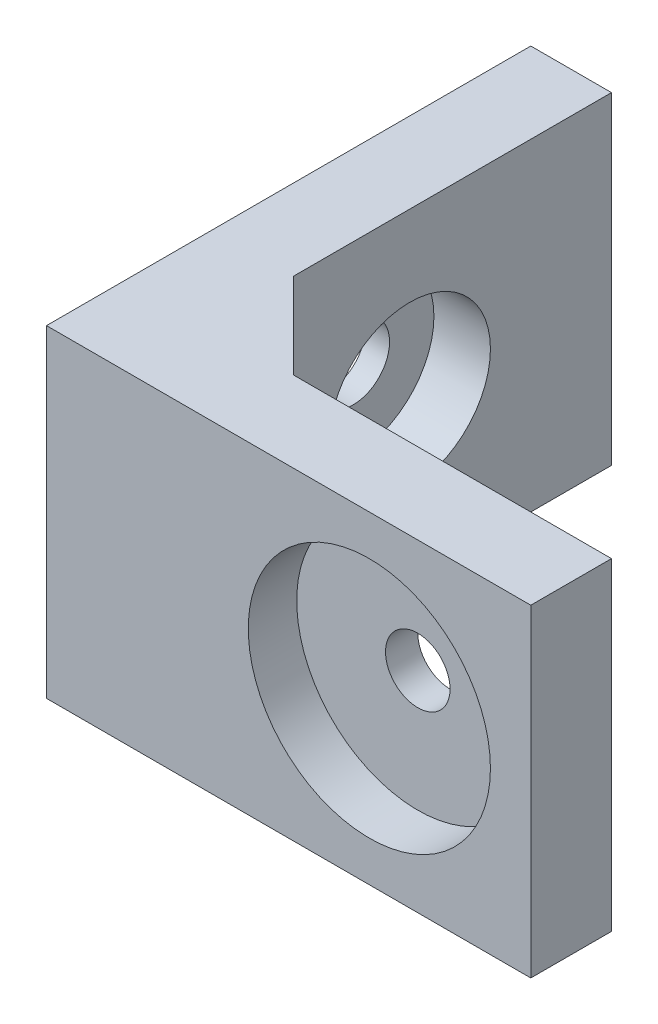
ISO-10303-21;
HEADER;
FILE_DESCRIPTION(('STEP AP214'),'2;1');
FILE_NAME('part.step','',(''),(''),'','','');
FILE_SCHEMA(('AUTOMOTIVE_DESIGN { 1 0 10303 214 1 1 1 1 }'));
ENDSEC;
DATA;
#1=APPLICATION_CONTEXT('core data for automotive mechanical design processes');
#2=APPLICATION_PROTOCOL_DEFINITION('international standard','automotive_design',2000,#1);
#3=PRODUCT_CONTEXT('',#1,'mechanical');
#4=PRODUCT('Part','Part','',(#3));
#5=PRODUCT_RELATED_PRODUCT_CATEGORY('part','',(#4));
#6=PRODUCT_DEFINITION_FORMATION('','',#4);
#7=PRODUCT_DEFINITION_CONTEXT('part definition',#1,'design');
#8=PRODUCT_DEFINITION('design','',#6,#7);
#9=PRODUCT_DEFINITION_SHAPE('','',#8);
#10=(LENGTH_UNIT() NAMED_UNIT(*) SI_UNIT(.MILLI.,.METRE.));
#11=(NAMED_UNIT(*) PLANE_ANGLE_UNIT() SI_UNIT($,.RADIAN.));
#12=(NAMED_UNIT(*) SI_UNIT($,.STERADIAN.) SOLID_ANGLE_UNIT());
#13=UNCERTAINTY_MEASURE_WITH_UNIT(LENGTH_MEASURE(1.E-05),#10,'distance_accuracy_value','');
#14=(GEOMETRIC_REPRESENTATION_CONTEXT(3) GLOBAL_UNCERTAINTY_ASSIGNED_CONTEXT((#13)) GLOBAL_UNIT_ASSIGNED_CONTEXT((#10,
#11,#12)) REPRESENTATION_CONTEXT('',''));
#15=CARTESIAN_POINT('',(0.,0.,0.));
#16=DIRECTION('',(0.,0.,1.));
#17=DIRECTION('',(1.,0.,0.));
#18=AXIS2_PLACEMENT_3D('',#15,#16,#17);
#19=CARTESIAN_POINT('',(0.,20.,-30.));
#20=DIRECTION('',(0.,0.,1.));
#21=DIRECTION('',(1.,0.,0.));
#22=AXIS2_PLACEMENT_3D('',#19,#20,#21);
#23=PLANE('',#22);
#24=DIRECTION('',(-1.,0.,0.));
#25=VECTOR('',#24,1.);
#26=CARTESIAN_POINT('',(0.,0.,-30.));
#27=LINE('',#26,#25);
#28=CARTESIAN_POINT('',(5.,0.,-30.));
#29=VERTEX_POINT('',#28);
#30=CARTESIAN_POINT('',(0.,0.,-30.));
#31=VERTEX_POINT('',#30);
#32=EDGE_CURVE('E130',#29,#31,#27,.T.);
#33=ORIENTED_EDGE('',*,*,#32,.T.);
#34=DIRECTION('',(0.,-1.,0.));
#35=VECTOR('',#34,1.);
#36=CARTESIAN_POINT('',(0.,20.,-30.));
#37=LINE('',#36,#35);
#38=CARTESIAN_POINT('',(0.,20.,-30.));
#39=VERTEX_POINT('',#38);
#40=EDGE_CURVE('E11',#39,#31,#37,.T.);
#41=ORIENTED_EDGE('',*,*,#40,.F.);
#42=DIRECTION('',(-1.,0.,0.));
#43=VECTOR('',#42,1.);
#44=CARTESIAN_POINT('',(0.,20.,-30.));
#45=LINE('',#44,#43);
#46=CARTESIAN_POINT('',(5.,20.,-30.));
#47=VERTEX_POINT('',#46);
#48=EDGE_CURVE('E143',#47,#39,#45,.T.);
#49=ORIENTED_EDGE('',*,*,#48,.F.);
#50=DIRECTION('',(0.,-1.,0.));
#51=VECTOR('',#50,1.);
#52=CARTESIAN_POINT('',(5.,20.,-30.));
#53=LINE('',#52,#51);
#54=EDGE_CURVE('E126',#47,#29,#53,.T.);
#55=ORIENTED_EDGE('',*,*,#54,.T.);
#56=EDGE_LOOP('',(#33,#41,#49,#55));
#57=FACE_BOUND('',#56,.T.);
#58=ADVANCED_FACE('F38',(#57),#23,.F.);
#59=CARTESIAN_POINT('',(0.,20.,0.));
#60=DIRECTION('',(1.,0.,0.));
#61=DIRECTION('',(0.,0.,-1.));
#62=AXIS2_PLACEMENT_3D('',#59,#60,#61);
#63=PLANE('',#62);
#64=CARTESIAN_POINT('',(0.,10.,-17.5));
#65=DIRECTION('',(1.,0.,0.));
#66=DIRECTION('',(0.,0.,-1.));
#67=AXIS2_PLACEMENT_3D('',#64,#65,#66);
#68=CIRCLE('',#67,2.25);
#69=CARTESIAN_POINT('',(0.,10.,-19.75));
#70=VERTEX_POINT('',#69);
#71=EDGE_CURVE('E134',#70,#70,#68,.T.);
#72=ORIENTED_EDGE('',*,*,#71,.T.);
#73=EDGE_LOOP('',(#72));
#74=FACE_BOUND('',#73,.T.);
#75=DIRECTION('',(0.,0.,1.));
#76=VECTOR('',#75,1.);
#77=CARTESIAN_POINT('',(0.,0.,0.));
#78=LINE('',#77,#76);
#79=CARTESIAN_POINT('',(0.,0.,0.));
#80=VERTEX_POINT('',#79);
#81=EDGE_CURVE('E133',#31,#80,#78,.T.);
#82=ORIENTED_EDGE('',*,*,#81,.T.);
#83=DIRECTION('',(0.,-1.,0.));
#84=VECTOR('',#83,1.);
#85=CARTESIAN_POINT('',(0.,20.,0.));
#86=LINE('',#85,#84);
#87=CARTESIAN_POINT('',(0.,20.,0.));
#88=VERTEX_POINT('',#87);
#89=EDGE_CURVE('E47',#88,#80,#86,.T.);
#90=ORIENTED_EDGE('',*,*,#89,.F.);
#91=DIRECTION('',(0.,0.,1.));
#92=VECTOR('',#91,1.);
#93=CARTESIAN_POINT('',(0.,20.,0.));
#94=LINE('',#93,#92);
#95=EDGE_CURVE('E96',#39,#88,#94,.T.);
#96=ORIENTED_EDGE('',*,*,#95,.F.);
#97=ORIENTED_EDGE('',*,*,#40,.T.);
#98=EDGE_LOOP('',(#82,#90,#96,#97));
#99=FACE_BOUND('',#98,.T.);
#100=ADVANCED_FACE('F195',(#74,#99),#63,.F.);
#101=CARTESIAN_POINT('',(30.,20.,0.));
#102=DIRECTION('',(0.,0.,-1.));
#103=DIRECTION('',(-1.,0.,0.));
#104=AXIS2_PLACEMENT_3D('',#101,#102,#103);
#105=PLANE('',#104);
#106=CARTESIAN_POINT('',(20.,10.,0.));
#107=DIRECTION('',(0.,0.,1.));
#108=DIRECTION('',(1.,0.,0.));
#109=AXIS2_PLACEMENT_3D('',#106,#107,#108);
#110=CIRCLE('',#109,7.5);
#111=CARTESIAN_POINT('',(27.5,10.,0.));
#112=VERTEX_POINT('',#111);
#113=EDGE_CURVE('E215',#112,#112,#110,.T.);
#114=ORIENTED_EDGE('',*,*,#113,.F.);
#115=EDGE_LOOP('',(#114));
#116=FACE_BOUND('',#115,.T.);
#117=DIRECTION('',(1.,0.,0.));
#118=VECTOR('',#117,1.);
#119=CARTESIAN_POINT('',(30.,0.,0.));
#120=LINE('',#119,#118);
#121=CARTESIAN_POINT('',(30.,0.,0.));
#122=VERTEX_POINT('',#121);
#123=EDGE_CURVE('E136',#80,#122,#120,.T.);
#124=ORIENTED_EDGE('',*,*,#123,.T.);
#125=DIRECTION('',(0.,-1.,0.));
#126=VECTOR('',#125,1.);
#127=CARTESIAN_POINT('',(30.,20.,0.));
#128=LINE('',#127,#126);
#129=CARTESIAN_POINT('',(30.,20.,0.));
#130=VERTEX_POINT('',#129);
#131=EDGE_CURVE('E147',#130,#122,#128,.T.);
#132=ORIENTED_EDGE('',*,*,#131,.F.);
#133=DIRECTION('',(1.,0.,0.));
#134=VECTOR('',#133,1.);
#135=CARTESIAN_POINT('',(30.,20.,0.));
#136=LINE('',#135,#134);
#137=EDGE_CURVE('E167',#88,#130,#136,.T.);
#138=ORIENTED_EDGE('',*,*,#137,.F.);
#139=ORIENTED_EDGE('',*,*,#89,.T.);
#140=EDGE_LOOP('',(#124,#132,#138,#139));
#141=FACE_BOUND('',#140,.T.);
#142=ADVANCED_FACE('F171',(#116,#141),#105,.F.);
#143=CARTESIAN_POINT('',(30.,20.,-5.));
#144=DIRECTION('',(-1.,0.,0.));
#145=DIRECTION('',(0.,0.,1.));
#146=AXIS2_PLACEMENT_3D('',#143,#144,#145);
#147=PLANE('',#146);
#148=DIRECTION('',(0.,0.,-1.));
#149=VECTOR('',#148,1.);
#150=CARTESIAN_POINT('',(30.,0.,-5.));
#151=LINE('',#150,#149);
#152=CARTESIAN_POINT('',(30.,0.,-5.));
#153=VERTEX_POINT('',#152);
#154=EDGE_CURVE('E138',#122,#153,#151,.T.);
#155=ORIENTED_EDGE('',*,*,#154,.T.);
#156=DIRECTION('',(0.,-1.,0.));
#157=VECTOR('',#156,1.);
#158=CARTESIAN_POINT('',(30.,20.,-5.));
#159=LINE('',#158,#157);
#160=CARTESIAN_POINT('',(30.,20.,-5.));
#161=VERTEX_POINT('',#160);
#162=EDGE_CURVE('E121',#161,#153,#159,.T.);
#163=ORIENTED_EDGE('',*,*,#162,.F.);
#164=DIRECTION('',(0.,0.,-1.));
#165=VECTOR('',#164,1.);
#166=CARTESIAN_POINT('',(30.,20.,-5.));
#167=LINE('',#166,#165);
#168=EDGE_CURVE('E112',#130,#161,#167,.T.);
#169=ORIENTED_EDGE('',*,*,#168,.F.);
#170=ORIENTED_EDGE('',*,*,#131,.T.);
#171=EDGE_LOOP('',(#155,#163,#169,#170));
#172=FACE_BOUND('',#171,.T.);
#173=ADVANCED_FACE('F175',(#172),#147,.F.);
#174=CARTESIAN_POINT('',(10.3033008588991,20.,-5.));
#175=DIRECTION('',(0.,0.,1.));
#176=DIRECTION('',(1.,0.,0.));
#177=AXIS2_PLACEMENT_3D('',#174,#175,#176);
#178=PLANE('',#177);
#179=CARTESIAN_POINT('',(20.,10.,-5.));
#180=DIRECTION('',(0.,0.,1.));
#181=DIRECTION('',(1.,0.,0.));
#182=AXIS2_PLACEMENT_3D('',#179,#180,#181);
#183=CIRCLE('',#182,2.);
#184=CARTESIAN_POINT('',(22.,10.,-5.));
#185=VERTEX_POINT('',#184);
#186=EDGE_CURVE('E213',#185,#185,#183,.T.);
#187=ORIENTED_EDGE('',*,*,#186,.T.);
#188=EDGE_LOOP('',(#187));
#189=FACE_BOUND('',#188,.T.);
#190=DIRECTION('',(-1.,0.,0.));
#191=VECTOR('',#190,1.);
#192=CARTESIAN_POINT('',(10.3033008588991,0.,-5.));
#193=LINE('',#192,#191);
#194=CARTESIAN_POINT('',(10.3033008588991,0.,-5.));
#195=VERTEX_POINT('',#194);
#196=EDGE_CURVE('E120',#153,#195,#193,.T.);
#197=ORIENTED_EDGE('',*,*,#196,.T.);
#198=DIRECTION('',(0.,-1.,0.));
#199=VECTOR('',#198,1.);
#200=CARTESIAN_POINT('',(10.3033008588991,20.,-5.));
#201=LINE('',#200,#199);
#202=CARTESIAN_POINT('',(10.3033008588991,20.,-5.));
#203=VERTEX_POINT('',#202);
#204=EDGE_CURVE('E117',#203,#195,#201,.T.);
#205=ORIENTED_EDGE('',*,*,#204,.F.);
#206=DIRECTION('',(-1.,0.,0.));
#207=VECTOR('',#206,1.);
#208=CARTESIAN_POINT('',(10.3033008588991,20.,-5.));
#209=LINE('',#208,#207);
#210=EDGE_CURVE('E106',#161,#203,#209,.T.);
#211=ORIENTED_EDGE('',*,*,#210,.F.);
#212=ORIENTED_EDGE('',*,*,#162,.T.);
#213=EDGE_LOOP('',(#197,#205,#211,#212));
#214=FACE_BOUND('',#213,.T.);
#215=ADVANCED_FACE('F118',(#189,#214),#178,.F.);
#216=CARTESIAN_POINT('',(5.,20.,-10.3033008588991));
#217=DIRECTION('',(-0.707106781186548,0.,0.707106781186548));
#218=DIRECTION('',(0.707106781186548,0.,0.707106781186548));
#219=AXIS2_PLACEMENT_3D('',#216,#217,#218);
#220=PLANE('',#219);
#221=DIRECTION('',(-0.707106781186548,0.,-0.707106781186548));
#222=VECTOR('',#221,1.);
#223=CARTESIAN_POINT('',(5.,0.,-10.3033008588991));
#224=LINE('',#223,#222);
#225=CARTESIAN_POINT('',(5.,0.,-10.3033008588991));
#226=VERTEX_POINT('',#225);
#227=EDGE_CURVE('E82',#195,#226,#224,.T.);
#228=ORIENTED_EDGE('',*,*,#227,.T.);
#229=DIRECTION('',(0.,-1.,0.));
#230=VECTOR('',#229,1.);
#231=CARTESIAN_POINT('',(5.,20.,-10.3033008588991));
#232=LINE('',#231,#230);
#233=CARTESIAN_POINT('',(5.,20.,-10.3033008588991));
#234=VERTEX_POINT('',#233);
#235=EDGE_CURVE('E122',#234,#226,#232,.T.);
#236=ORIENTED_EDGE('',*,*,#235,.F.);
#237=DIRECTION('',(-0.707106781186548,0.,-0.707106781186548));
#238=VECTOR('',#237,1.);
#239=CARTESIAN_POINT('',(5.,20.,-10.3033008588991));
#240=LINE('',#239,#238);
#241=EDGE_CURVE('E110',#203,#234,#240,.T.);
#242=ORIENTED_EDGE('',*,*,#241,.F.);
#243=ORIENTED_EDGE('',*,*,#204,.T.);
#244=EDGE_LOOP('',(#228,#236,#242,#243));
#245=FACE_BOUND('',#244,.T.);
#246=ADVANCED_FACE('F124',(#245),#220,.F.);
#247=CARTESIAN_POINT('',(5.,20.,-30.));
#248=DIRECTION('',(-1.,0.,0.));
#249=DIRECTION('',(0.,0.,1.));
#250=AXIS2_PLACEMENT_3D('',#247,#248,#249);
#251=PLANE('',#250);
#252=CARTESIAN_POINT('',(5.,10.,-17.5));
#253=DIRECTION('',(1.,0.,0.));
#254=DIRECTION('',(0.,0.,-1.));
#255=AXIS2_PLACEMENT_3D('',#252,#253,#254);
#256=CIRCLE('',#255,5.);
#257=CARTESIAN_POINT('',(5.,10.,-22.5));
#258=VERTEX_POINT('',#257);
#259=EDGE_CURVE('E161',#258,#258,#256,.T.);
#260=ORIENTED_EDGE('',*,*,#259,.F.);
#261=EDGE_LOOP('',(#260));
#262=FACE_BOUND('',#261,.T.);
#263=DIRECTION('',(0.,0.,-1.));
#264=VECTOR('',#263,1.);
#265=CARTESIAN_POINT('',(5.,0.,-30.));
#266=LINE('',#265,#264);
#267=EDGE_CURVE('E88',#226,#29,#266,.T.);
#268=ORIENTED_EDGE('',*,*,#267,.T.);
#269=ORIENTED_EDGE('',*,*,#54,.F.);
#270=DIRECTION('',(0.,0.,-1.));
#271=VECTOR('',#270,1.);
#272=CARTESIAN_POINT('',(5.,20.,-30.));
#273=LINE('',#272,#271);
#274=EDGE_CURVE('E56',#234,#47,#273,.T.);
#275=ORIENTED_EDGE('',*,*,#274,.F.);
#276=ORIENTED_EDGE('',*,*,#235,.T.);
#277=EDGE_LOOP('',(#268,#269,#275,#276));
#278=FACE_BOUND('',#277,.T.);
#279=ADVANCED_FACE('F182',(#262,#278),#251,.F.);
#280=CARTESIAN_POINT('',(0.,20.,0.));
#281=DIRECTION('',(0.,-1.,0.));
#282=DIRECTION('',(0.,0.,-1.));
#283=AXIS2_PLACEMENT_3D('',#280,#281,#282);
#284=PLANE('',#283);
#285=ORIENTED_EDGE('',*,*,#48,.T.);
#286=ORIENTED_EDGE('',*,*,#95,.T.);
#287=ORIENTED_EDGE('',*,*,#137,.T.);
#288=ORIENTED_EDGE('',*,*,#168,.T.);
#289=ORIENTED_EDGE('',*,*,#210,.T.);
#290=ORIENTED_EDGE('',*,*,#241,.T.);
#291=ORIENTED_EDGE('',*,*,#274,.T.);
#292=EDGE_LOOP('',(#285,#286,#287,#288,#289,#290,#291));
#293=FACE_BOUND('',#292,.T.);
#294=ADVANCED_FACE('F108',(#293),#284,.F.);
#295=CARTESIAN_POINT('',(0.,0.,0.));
#296=DIRECTION('',(0.,-1.,0.));
#297=DIRECTION('',(0.,0.,-1.));
#298=AXIS2_PLACEMENT_3D('',#295,#296,#297);
#299=PLANE('',#298);
#300=ORIENTED_EDGE('',*,*,#32,.F.);
#301=ORIENTED_EDGE('',*,*,#267,.F.);
#302=ORIENTED_EDGE('',*,*,#227,.F.);
#303=ORIENTED_EDGE('',*,*,#196,.F.);
#304=ORIENTED_EDGE('',*,*,#154,.F.);
#305=ORIENTED_EDGE('',*,*,#123,.F.);
#306=ORIENTED_EDGE('',*,*,#81,.F.);
#307=EDGE_LOOP('',(#300,#301,#302,#303,#304,#305,#306));
#308=FACE_BOUND('',#307,.T.);
#309=ADVANCED_FACE('F178',(#308),#299,.T.);
#310=CARTESIAN_POINT('',(5.,10.,-17.5));
#311=DIRECTION('',(1.,0.,0.));
#312=DIRECTION('',(0.,0.,-1.));
#313=AXIS2_PLACEMENT_3D('',#310,#311,#312);
#314=CYLINDRICAL_SURFACE('',#313,2.25);
#315=CARTESIAN_POINT('',(1.5,10.,-17.5));
#316=DIRECTION('',(1.,0.,0.));
#317=DIRECTION('',(0.,0.,-1.));
#318=AXIS2_PLACEMENT_3D('',#315,#316,#317);
#319=CIRCLE('',#318,2.25);
#320=CARTESIAN_POINT('',(1.5,10.,-19.75));
#321=VERTEX_POINT('',#320);
#322=EDGE_CURVE('E152',#321,#321,#319,.T.);
#323=ORIENTED_EDGE('',*,*,#322,.T.);
#324=EDGE_LOOP('',(#323));
#325=FACE_BOUND('',#324,.T.);
#326=ORIENTED_EDGE('',*,*,#71,.F.);
#327=EDGE_LOOP('',(#326));
#328=FACE_BOUND('',#327,.T.);
#329=ADVANCED_FACE('F238',(#325,#328),#314,.F.);
#330=CARTESIAN_POINT('',(1.5,12.25,-17.5));
#331=DIRECTION('',(-1.,0.,0.));
#332=DIRECTION('',(0.,0.,1.));
#333=AXIS2_PLACEMENT_3D('',#330,#331,#332);
#334=PLANE('',#333);
#335=ORIENTED_EDGE('',*,*,#322,.F.);
#336=EDGE_LOOP('',(#335));
#337=FACE_BOUND('',#336,.T.);
#338=CARTESIAN_POINT('',(1.5,10.,-17.5));
#339=DIRECTION('',(1.,0.,0.));
#340=DIRECTION('',(0.,0.,-1.));
#341=AXIS2_PLACEMENT_3D('',#338,#339,#340);
#342=CIRCLE('',#341,5.);
#343=CARTESIAN_POINT('',(1.5,10.,-22.5));
#344=VERTEX_POINT('',#343);
#345=EDGE_CURVE('E156',#344,#344,#342,.T.);
#346=ORIENTED_EDGE('',*,*,#345,.T.);
#347=EDGE_LOOP('',(#346));
#348=FACE_BOUND('',#347,.T.);
#349=ADVANCED_FACE('F228',(#337,#348),#334,.F.);
#350=CARTESIAN_POINT('',(5.,10.,-17.5));
#351=DIRECTION('',(1.,0.,0.));
#352=DIRECTION('',(0.,0.,-1.));
#353=AXIS2_PLACEMENT_3D('',#350,#351,#352);
#354=CYLINDRICAL_SURFACE('',#353,5.);
#355=ORIENTED_EDGE('',*,*,#345,.F.);
#356=EDGE_LOOP('',(#355));
#357=FACE_BOUND('',#356,.T.);
#358=ORIENTED_EDGE('',*,*,#259,.T.);
#359=EDGE_LOOP('',(#358));
#360=FACE_BOUND('',#359,.T.);
#361=ADVANCED_FACE('F225',(#357,#360),#354,.F.);
#362=CARTESIAN_POINT('',(20.,10.,-3.));
#363=DIRECTION('',(0.,0.,1.));
#364=DIRECTION('',(1.,0.,0.));
#365=AXIS2_PLACEMENT_3D('',#362,#363,#364);
#366=CYLINDRICAL_SURFACE('',#365,7.5);
#367=CARTESIAN_POINT('',(20.,10.,-3.));
#368=DIRECTION('',(0.,0.,1.));
#369=DIRECTION('',(1.,0.,0.));
#370=AXIS2_PLACEMENT_3D('',#367,#368,#369);
#371=CIRCLE('',#370,7.5);
#372=CARTESIAN_POINT('',(27.5,10.,-3.));
#373=VERTEX_POINT('',#372);
#374=EDGE_CURVE('E218',#373,#373,#371,.T.);
#375=ORIENTED_EDGE('',*,*,#374,.F.);
#376=EDGE_LOOP('',(#375));
#377=FACE_BOUND('',#376,.T.);
#378=ORIENTED_EDGE('',*,*,#113,.T.);
#379=EDGE_LOOP('',(#378));
#380=FACE_BOUND('',#379,.T.);
#381=ADVANCED_FACE('F227',(#377,#380),#366,.F.);
#382=CARTESIAN_POINT('',(20.,10.,-3.));
#383=DIRECTION('',(0.,0.,1.));
#384=DIRECTION('',(1.,0.,0.));
#385=AXIS2_PLACEMENT_3D('',#382,#383,#384);
#386=PLANE('',#385);
#387=CARTESIAN_POINT('',(20.,10.,-3.));
#388=DIRECTION('',(0.,0.,1.));
#389=DIRECTION('',(1.,0.,0.));
#390=AXIS2_PLACEMENT_3D('',#387,#388,#389);
#391=CIRCLE('',#390,2.);
#392=CARTESIAN_POINT('',(22.,10.,-3.));
#393=VERTEX_POINT('',#392);
#394=EDGE_CURVE('E41',#393,#393,#391,.T.);
#395=ORIENTED_EDGE('',*,*,#394,.F.);
#396=EDGE_LOOP('',(#395));
#397=FACE_BOUND('',#396,.T.);
#398=ORIENTED_EDGE('',*,*,#374,.T.);
#399=EDGE_LOOP('',(#398));
#400=FACE_BOUND('',#399,.T.);
#401=ADVANCED_FACE('F235',(#397,#400),#386,.T.);
#402=CARTESIAN_POINT('',(20.,10.,0.));
#403=DIRECTION('',(0.,0.,1.));
#404=DIRECTION('',(1.,0.,0.));
#405=AXIS2_PLACEMENT_3D('',#402,#403,#404);
#406=CYLINDRICAL_SURFACE('',#405,2.);
#407=ORIENTED_EDGE('',*,*,#394,.T.);
#408=EDGE_LOOP('',(#407));
#409=FACE_BOUND('',#408,.T.);
#410=ORIENTED_EDGE('',*,*,#186,.F.);
#411=EDGE_LOOP('',(#410));
#412=FACE_BOUND('',#411,.T.);
#413=ADVANCED_FACE('F295',(#409,#412),#406,.F.);
#414=CLOSED_SHELL('',(#58,#100,#142,#173,#215,#246,#279,#294,#309,#329,#349,#361,#381,#401,#413));
#415=MANIFOLD_SOLID_BREP('B2',#414);
#416=ADVANCED_BREP_SHAPE_REPRESENTATION('',(#18,#415),#14);
#417=SHAPE_DEFINITION_REPRESENTATION(#9,#416);
ENDSEC;
END-ISO-10303-21;
